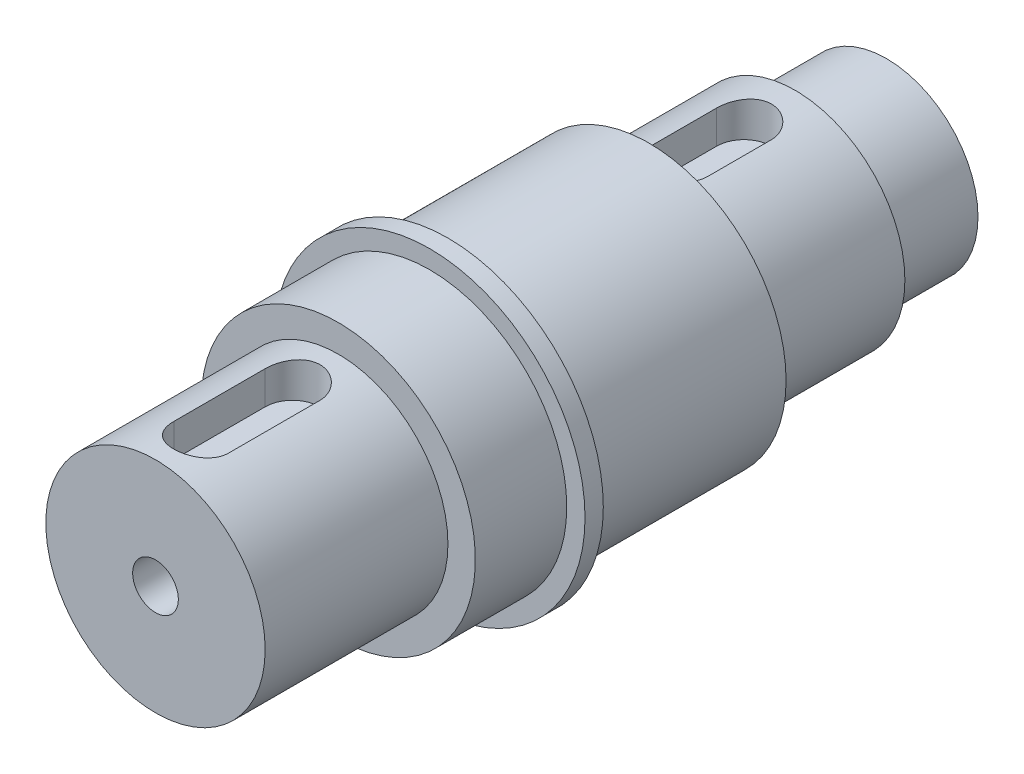
ISO-10303-21;
HEADER;
FILE_DESCRIPTION(('STEP AP214'),'2;1');
FILE_NAME('part.step','',(''),(''),'','','');
FILE_SCHEMA(('AUTOMOTIVE_DESIGN { 1 0 10303 214 1 1 1 1 }'));
ENDSEC;
DATA;
#1=APPLICATION_CONTEXT('core data for automotive mechanical design processes');
#2=APPLICATION_PROTOCOL_DEFINITION('international standard','automotive_design',2000,#1);
#3=PRODUCT_CONTEXT('',#1,'mechanical');
#4=PRODUCT('Part','Part','',(#3));
#5=PRODUCT_RELATED_PRODUCT_CATEGORY('part','',(#4));
#6=PRODUCT_DEFINITION_FORMATION('','',#4);
#7=PRODUCT_DEFINITION_CONTEXT('part definition',#1,'design');
#8=PRODUCT_DEFINITION('design','',#6,#7);
#9=PRODUCT_DEFINITION_SHAPE('','',#8);
#10=(LENGTH_UNIT() NAMED_UNIT(*) SI_UNIT(.MILLI.,.METRE.));
#11=(NAMED_UNIT(*) PLANE_ANGLE_UNIT() SI_UNIT($,.RADIAN.));
#12=(NAMED_UNIT(*) SI_UNIT($,.STERADIAN.) SOLID_ANGLE_UNIT());
#13=UNCERTAINTY_MEASURE_WITH_UNIT(LENGTH_MEASURE(1.E-05),#10,'distance_accuracy_value','');
#14=(GEOMETRIC_REPRESENTATION_CONTEXT(3) GLOBAL_UNCERTAINTY_ASSIGNED_CONTEXT((#13)) GLOBAL_UNIT_ASSIGNED_CONTEXT((#10,
#11,#12)) REPRESENTATION_CONTEXT('',''));
#15=CARTESIAN_POINT('',(0.,0.,0.));
#16=DIRECTION('',(0.,0.,1.));
#17=DIRECTION('',(1.,0.,0.));
#18=AXIS2_PLACEMENT_3D('',#15,#16,#17);
#19=CARTESIAN_POINT('',(0.,0.,29.));
#20=DIRECTION('',(0.,0.,-1.));
#21=DIRECTION('',(-1.,0.,0.));
#22=AXIS2_PLACEMENT_3D('',#19,#20,#21);
#23=CYLINDRICAL_SURFACE('',#22,7.5);
#24=CARTESIAN_POINT('',(0.,0.,13.));
#25=DIRECTION('',(0.,0.,1.));
#26=DIRECTION('',(1.,0.,0.));
#27=AXIS2_PLACEMENT_3D('',#24,#25,#26);
#28=CIRCLE('',#27,7.5);
#29=CARTESIAN_POINT('',(7.5,0.,13.));
#30=VERTEX_POINT('',#29);
#31=EDGE_CURVE('E161',#30,#30,#28,.T.);
#32=ORIENTED_EDGE('',*,*,#31,.T.);
#33=EDGE_LOOP('',(#32));
#34=FACE_BOUND('',#33,.T.);
#35=CARTESIAN_POINT('',(0.,0.,24.));
#36=DIRECTION('',(0.,0.,1.));
#37=DIRECTION('',(1.,0.,0.));
#38=AXIS2_PLACEMENT_3D('',#35,#36,#37);
#39=CIRCLE('',#38,7.5);
#40=CARTESIAN_POINT('',(7.5,0.,24.));
#41=VERTEX_POINT('',#40);
#42=EDGE_CURVE('E11',#41,#41,#39,.T.);
#43=ORIENTED_EDGE('',*,*,#42,.F.);
#44=EDGE_LOOP('',(#43));
#45=FACE_BOUND('',#44,.T.);
#46=ADVANCED_FACE('F43',(#34,#45),#23,.T.);
#47=CARTESIAN_POINT('',(0.,0.,5.));
#48=DIRECTION('',(0.,0.,-1.));
#49=DIRECTION('',(-1.,0.,0.));
#50=AXIS2_PLACEMENT_3D('',#47,#48,#49);
#51=CYLINDRICAL_SURFACE('',#50,5.);
#52=CARTESIAN_POINT('',(0.,0.,5.));
#53=DIRECTION('',(0.,0.,1.));
#54=DIRECTION('',(1.,0.,0.));
#55=AXIS2_PLACEMENT_3D('',#52,#53,#54);
#56=CIRCLE('',#55,5.);
#57=CARTESIAN_POINT('',(5.,0.,5.));
#58=VERTEX_POINT('',#57);
#59=EDGE_CURVE('E209',#58,#58,#56,.T.);
#60=ORIENTED_EDGE('',*,*,#59,.F.);
#61=EDGE_LOOP('',(#60));
#62=FACE_BOUND('',#61,.T.);
#63=CARTESIAN_POINT('',(0.,0.,0.));
#64=DIRECTION('',(0.,0.,1.));
#65=DIRECTION('',(1.,0.,0.));
#66=AXIS2_PLACEMENT_3D('',#63,#64,#65);
#67=CIRCLE('',#66,5.);
#68=CARTESIAN_POINT('',(5.,0.,0.));
#69=VERTEX_POINT('',#68);
#70=EDGE_CURVE('E208',#69,#69,#67,.T.);
#71=ORIENTED_EDGE('',*,*,#70,.T.);
#72=EDGE_LOOP('',(#71));
#73=FACE_BOUND('',#72,.T.);
#74=ADVANCED_FACE('F45',(#62,#73),#51,.T.);
#75=CARTESIAN_POINT('',(0.,0.,0.));
#76=DIRECTION('',(0.,0.,1.));
#77=DIRECTION('',(1.,0.,0.));
#78=AXIS2_PLACEMENT_3D('',#75,#76,#77);
#79=PLANE('',#78);
#80=ORIENTED_EDGE('',*,*,#70,.F.);
#81=EDGE_LOOP('',(#80));
#82=FACE_BOUND('',#81,.T.);
#83=ADVANCED_FACE('F255',(#82),#79,.F.);
#84=CARTESIAN_POINT('',(0.,0.,6.));
#85=DIRECTION('',(0.,0.,-1.));
#86=DIRECTION('',(-1.,0.,0.));
#87=AXIS2_PLACEMENT_3D('',#84,#85,#86);
#88=CYLINDRICAL_SURFACE('',#87,6.);
#89=DIRECTION('',(0.,0.,-1.));
#90=VECTOR('',#89,1.);
#91=CARTESIAN_POINT('',(1.5,5.80947501931113,6.));
#92=LINE('',#91,#90);
#93=CARTESIAN_POINT('',(1.5,5.80947501931113,7.8));
#94=VERTEX_POINT('',#93);
#95=CARTESIAN_POINT('',(1.5,5.80947501931113,11.3));
#96=VERTEX_POINT('',#95);
#97=EDGE_CURVE('E167',#94,#96,#92,.F.);
#98=ORIENTED_EDGE('',*,*,#97,.T.);
#99=CARTESIAN_POINT('',(1.5,5.80947501931113,11.3));
#100=CARTESIAN_POINT('',(1.50000050624417,5.80947222870266,11.3414944776598));
#101=CARTESIAN_POINT('',(1.49827711106305,5.80992014924206,11.3829683945273));
#102=CARTESIAN_POINT('',(1.49140694309363,5.81168857161838,11.4656060529553));
#103=CARTESIAN_POINT('',(1.48626074635902,5.81300892662531,11.5067698455306));
#104=CARTESIAN_POINT('',(1.46576285907379,5.81822566458081,11.6291797598133));
#105=CARTESIAN_POINT('',(1.44535154275874,5.82337804723213,11.7095847027233));
#106=CARTESIAN_POINT('',(1.391697114372,5.83643133882004,11.8656870106729));
#107=CARTESIAN_POINT('',(1.35845520813575,5.84433198946395,11.9413848173193));
#108=CARTESIAN_POINT('',(1.2801230670388,5.86198701707909,12.086167172971));
#109=CARTESIAN_POINT('',(1.2350296550354,5.87174189093471,12.1552499418365));
#110=CARTESIAN_POINT('',(1.1332267077421,5.89224393597038,12.2863158228592));
#111=CARTESIAN_POINT('',(1.07630590317596,5.90300686543374,12.3481323293683));
#112=CARTESIAN_POINT('',(0.952913670774347,5.9241765659429,12.4614531342241));
#113=CARTESIAN_POINT('',(0.886440719218249,5.93458327983806,12.5129557842019));
#114=CARTESIAN_POINT('',(0.744685349102538,5.95404273424872,12.604866502428));
#115=CARTESIAN_POINT('',(0.669293010501713,5.96307457022596,12.645109843976));
#116=CARTESIAN_POINT('',(0.51255388626438,5.97858519375883,12.7122871012951));
#117=CARTESIAN_POINT('',(0.431208276124516,5.98506448372051,12.7392236364497));
#118=CARTESIAN_POINT('',(0.266616162787742,5.99462850007692,12.7784884891662));
#119=CARTESIAN_POINT('',(0.183441483004288,5.99777929351951,12.7911015086342));
#120=CARTESIAN_POINT('',(0.0160991635225212,6.00056157226223,12.8022550573149));
#121=CARTESIAN_POINT('',(-0.0680683500430564,6.00019349990167,12.8007973552885));
#122=CARTESIAN_POINT('',(-0.233028739458142,5.99602856048604,12.7840550544718));
#123=CARTESIAN_POINT('',(-0.313855052609781,5.99230798016041,12.7690780751008));
#124=CARTESIAN_POINT('',(-0.471808066626508,5.98194495954744,12.7262169812259));
#125=CARTESIAN_POINT('',(-0.548934603635979,5.97530238998334,12.6983322956471));
#126=CARTESIAN_POINT('',(-0.698110929036807,5.95972496642698,12.630198078994));
#127=CARTESIAN_POINT('',(-0.770108444403371,5.95076990741333,12.5898389086507));
#128=CARTESIAN_POINT('',(-0.90641494684502,5.93153918312879,12.4979853052498));
#129=CARTESIAN_POINT('',(-0.970722773343431,5.92126331899798,12.4464891946202));
#130=CARTESIAN_POINT('',(-1.09165408456273,5.90018349034298,12.332181631878));
#131=CARTESIAN_POINT('',(-1.14802365458119,5.88937275716528,12.2691025451903));
#132=CARTESIAN_POINT('',(-1.24945436277935,5.8686925242601,12.1342551996084));
#133=CARTESIAN_POINT('',(-1.29451240536759,5.8588232826449,12.0624845700747));
#134=CARTESIAN_POINT('',(-1.37220706392894,5.84111720379488,11.9117816032644));
#135=CARTESIAN_POINT('',(-1.4047755268309,5.83329159013705,11.8328128026559));
#136=CARTESIAN_POINT('',(-1.45605352777474,5.82070588210583,11.6703246073726));
#137=CARTESIAN_POINT('',(-1.4747837838182,5.81594120642153,11.5868122172752));
#138=CARTESIAN_POINT('',(-1.49085695272641,5.81182936022286,11.4688139288616));
#139=CARTESIAN_POINT('',(-1.49428618645006,5.8109478466629,11.4351204451802));
#140=CARTESIAN_POINT('',(-1.49885513654609,5.80977093733462,11.367623315136));
#141=CARTESIAN_POINT('',(-1.49999855714407,5.80947459329191,11.3338199360671));
#142=CARTESIAN_POINT('',(-1.5,5.80947501931113,11.3));
#143=B_SPLINE_CURVE_WITH_KNOTS('',3,(#99,#100,#101,#102,#103,#104,#105,#106,#107,#108,#109,#110,
#111,#112,#113,#114,#115,#116,#117,#118,#119,#120,#121,#122,#123,#124,#125,#126,#127,#128,#129,
#130,#131,#132,#133,#134,#135,#136,#137,#138,#139,#140,#141,#142),.UNSPECIFIED.,.F.,.F.,(4,2,2,
2,2,2,2,2,2,2,2,2,2,2,2,2,2,2,2,2,2,4),(0.,0.124404795509656,0.248788659126976,
0.496844944620475,0.744877923137249,0.992977462090125,1.24596284614196,1.49898863030879,
1.75554280647352,2.01204646098637,2.26335722272987,2.51463639384958,2.76033818218913,
3.00605084213757,3.25398764175564,3.50196181446493,3.75662144301813,4.01135068771451,
4.26745080241601,4.52316671309979,4.62473773083972,4.72614401597507),.UNSPECIFIED.);
#144=CARTESIAN_POINT('',(-1.5,5.80947501931113,11.3));
#145=VERTEX_POINT('',#144);
#146=EDGE_CURVE('E213',#96,#145,#143,.T.);
#147=ORIENTED_EDGE('',*,*,#146,.T.);
#148=DIRECTION('',(0.,0.,-1.));
#149=VECTOR('',#148,1.);
#150=CARTESIAN_POINT('',(-1.5,5.80947501931113,6.));
#151=LINE('',#150,#149);
#152=CARTESIAN_POINT('',(-1.5,5.80947501931113,7.8));
#153=VERTEX_POINT('',#152);
#154=EDGE_CURVE('E375',#145,#153,#151,.T.);
#155=ORIENTED_EDGE('',*,*,#154,.T.);
#156=CARTESIAN_POINT('',(-1.5,5.80947501931113,7.8));
#157=CARTESIAN_POINT('',(-1.50000050624417,5.80947222870266,7.75850552234019));
#158=CARTESIAN_POINT('',(-1.49827711106305,5.80992014924206,7.71703160547266));
#159=CARTESIAN_POINT('',(-1.49140694309363,5.81168857161838,7.63439394704465));
#160=CARTESIAN_POINT('',(-1.48626074635902,5.81300892662531,7.59323015446936));
#161=CARTESIAN_POINT('',(-1.46576285907379,5.81822566458081,7.47082024018673));
#162=CARTESIAN_POINT('',(-1.44535154275874,5.82337804723213,7.39041529727669));
#163=CARTESIAN_POINT('',(-1.391697114372,5.83643133882004,7.23431298932705));
#164=CARTESIAN_POINT('',(-1.35845520813575,5.84433198946395,7.15861518268072));
#165=CARTESIAN_POINT('',(-1.2801230670388,5.86198701707909,7.01383282702901));
#166=CARTESIAN_POINT('',(-1.2350296550354,5.8717418909347,6.94475005816355));
#167=CARTESIAN_POINT('',(-1.1332267077421,5.89224393597038,6.81368417714085));
#168=CARTESIAN_POINT('',(-1.07630590317596,5.90300686543374,6.75186767063172));
#169=CARTESIAN_POINT('',(-0.952913670774345,5.9241765659429,6.63854686577594));
#170=CARTESIAN_POINT('',(-0.886440719218246,5.93458327983806,6.58704421579809));
#171=CARTESIAN_POINT('',(-0.744685349102535,5.95404273424873,6.49513349757203));
#172=CARTESIAN_POINT('',(-0.669293010501709,5.96307457022595,6.45489015602404));
#173=CARTESIAN_POINT('',(-0.512553886264378,5.97858519375883,6.38771289870494));
#174=CARTESIAN_POINT('',(-0.431208276124514,5.98506448372051,6.36077636355025));
#175=CARTESIAN_POINT('',(-0.26661616278774,5.99462850007692,6.32151151083385));
#176=CARTESIAN_POINT('',(-0.183441483004286,5.99777929351951,6.30889849136577));
#177=CARTESIAN_POINT('',(-0.0160991635225185,6.00056157226223,6.29774494268506));
#178=CARTESIAN_POINT('',(0.0680683500430592,6.00019349990167,6.29920264471149));
#179=CARTESIAN_POINT('',(0.233028739458145,5.99602856048604,6.31594494552818));
#180=CARTESIAN_POINT('',(0.313855052609783,5.99230798016041,6.33092192489922));
#181=CARTESIAN_POINT('',(0.471808066626511,5.98194495954744,6.37378301877412));
#182=CARTESIAN_POINT('',(0.548934603635982,5.97530238998334,6.40166770435287));
#183=CARTESIAN_POINT('',(0.698110929036809,5.95972496642698,6.46980192100598));
#184=CARTESIAN_POINT('',(0.770108444403373,5.95076990741333,6.51016109134926));
#185=CARTESIAN_POINT('',(0.906414946845022,5.93153918312879,6.6020146947502));
#186=CARTESIAN_POINT('',(0.970722773343433,5.92126331899798,6.65351080537983));
#187=CARTESIAN_POINT('',(1.09165408456274,5.90018349034298,6.76781836812197));
#188=CARTESIAN_POINT('',(1.14802365458119,5.88937275716528,6.83089745480972));
#189=CARTESIAN_POINT('',(1.24945436277936,5.8686925242601,6.9657448003916));
#190=CARTESIAN_POINT('',(1.29451240536759,5.8588232826449,7.03751542992534));
#191=CARTESIAN_POINT('',(1.37220706392894,5.84111720379488,7.18821839673565));
#192=CARTESIAN_POINT('',(1.4047755268309,5.83329159013705,7.26718719734413));
#193=CARTESIAN_POINT('',(1.45605352777474,5.82070588210583,7.42967539262743));
#194=CARTESIAN_POINT('',(1.4747837838182,5.81594120642153,7.51318778272476));
#195=CARTESIAN_POINT('',(1.49085695272641,5.81182936022286,7.63118607113836));
#196=CARTESIAN_POINT('',(1.49428618645006,5.8109478466629,7.66487955481977));
#197=CARTESIAN_POINT('',(1.49885513654609,5.80977093733462,7.73237668486398));
#198=CARTESIAN_POINT('',(1.49999855714407,5.80947459329191,7.76618006393294));
#199=CARTESIAN_POINT('',(1.5,5.80947501931113,7.8));
#200=B_SPLINE_CURVE_WITH_KNOTS('',3,(#156,#157,#158,#159,#160,#161,#162,#163,#164,#165,#166,
#167,#168,#169,#170,#171,#172,#173,#174,#175,#176,#177,#178,#179,#180,#181,#182,#183,#184,#185,
#186,#187,#188,#189,#190,#191,#192,#193,#194,#195,#196,#197,#198,#199),.UNSPECIFIED.,.F.,.F.,(4,
2,2,2,2,2,2,2,2,2,2,2,2,2,2,2,2,2,2,2,2,4),(0.,0.124404795509654,0.248788659126977,
0.496844944620476,0.744877923137248,0.992977462090123,1.24596284614196,1.49898863030879,
1.75554280647352,2.01204646098637,2.26335722272987,2.51463639384958,2.76033818218913,
3.00605084213757,3.25398764175565,3.50196181446493,3.75662144301813,4.01135068771451,
4.26745080241601,4.52316671309979,4.62473773083972,4.72614401597507),.UNSPECIFIED.);
#201=EDGE_CURVE('E67',#153,#94,#200,.T.);
#202=ORIENTED_EDGE('',*,*,#201,.T.);
#203=EDGE_LOOP('',(#98,#147,#155,#202));
#204=FACE_BOUND('',#203,.T.);
#205=CARTESIAN_POINT('',(0.,0.,5.));
#206=DIRECTION('',(0.,0.,1.));
#207=DIRECTION('',(1.,0.,0.));
#208=AXIS2_PLACEMENT_3D('',#205,#206,#207);
#209=CIRCLE('',#208,6.);
#210=CARTESIAN_POINT('',(6.,0.,5.));
#211=VERTEX_POINT('',#210);
#212=EDGE_CURVE('E204',#211,#211,#209,.T.);
#213=ORIENTED_EDGE('',*,*,#212,.T.);
#214=EDGE_LOOP('',(#213));
#215=FACE_BOUND('',#214,.T.);
#216=CARTESIAN_POINT('',(0.,0.,13.));
#217=DIRECTION('',(0.,0.,1.));
#218=DIRECTION('',(1.,0.,0.));
#219=AXIS2_PLACEMENT_3D('',#216,#217,#218);
#220=CIRCLE('',#219,6.);
#221=CARTESIAN_POINT('',(6.,0.,13.));
#222=VERTEX_POINT('',#221);
#223=EDGE_CURVE('E191',#222,#222,#220,.T.);
#224=ORIENTED_EDGE('',*,*,#223,.F.);
#225=EDGE_LOOP('',(#224));
#226=FACE_BOUND('',#225,.T.);
#227=ADVANCED_FACE('F232',(#204,#215,#226),#88,.T.);
#228=CARTESIAN_POINT('',(0.,0.,5.));
#229=DIRECTION('',(0.,0.,1.));
#230=DIRECTION('',(1.,0.,0.));
#231=AXIS2_PLACEMENT_3D('',#228,#229,#230);
#232=PLANE('',#231);
#233=ORIENTED_EDGE('',*,*,#59,.T.);
#234=EDGE_LOOP('',(#233));
#235=FACE_BOUND('',#234,.T.);
#236=ORIENTED_EDGE('',*,*,#212,.F.);
#237=EDGE_LOOP('',(#236));
#238=FACE_BOUND('',#237,.T.);
#239=ADVANCED_FACE('F250',(#235,#238),#232,.F.);
#240=CARTESIAN_POINT('',(0.,4.,7.8));
#241=DIRECTION('',(0.,1.,0.));
#242=DIRECTION('',(0.,0.,1.));
#243=AXIS2_PLACEMENT_3D('',#240,#241,#242);
#244=CYLINDRICAL_SURFACE('',#243,1.5);
#245=DIRECTION('',(0.,1.,0.));
#246=VECTOR('',#245,1.);
#247=CARTESIAN_POINT('',(-1.5,4.,7.8));
#248=LINE('',#247,#246);
#249=CARTESIAN_POINT('',(-1.5,4.,7.8));
#250=VERTEX_POINT('',#249);
#251=EDGE_CURVE('E187',#250,#153,#248,.T.);
#252=ORIENTED_EDGE('',*,*,#251,.F.);
#253=CARTESIAN_POINT('',(0.,4.,7.8));
#254=DIRECTION('',(0.,1.,0.));
#255=DIRECTION('',(0.,0.,1.));
#256=AXIS2_PLACEMENT_3D('',#253,#254,#255);
#257=CIRCLE('',#256,1.5);
#258=CARTESIAN_POINT('',(1.5,4.,7.8));
#259=VERTEX_POINT('',#258);
#260=EDGE_CURVE('E171',#259,#250,#257,.T.);
#261=ORIENTED_EDGE('',*,*,#260,.F.);
#262=DIRECTION('',(0.,1.,0.));
#263=VECTOR('',#262,1.);
#264=CARTESIAN_POINT('',(1.5,4.,7.8));
#265=LINE('',#264,#263);
#266=EDGE_CURVE('E188',#259,#94,#265,.T.);
#267=ORIENTED_EDGE('',*,*,#266,.T.);
#268=ORIENTED_EDGE('',*,*,#201,.F.);
#269=EDGE_LOOP('',(#252,#261,#267,#268));
#270=FACE_BOUND('',#269,.T.);
#271=ADVANCED_FACE('F247',(#270),#244,.F.);
#272=CARTESIAN_POINT('',(1.5,4.,7.8));
#273=DIRECTION('',(1.,0.,0.));
#274=DIRECTION('',(0.,0.,-1.));
#275=AXIS2_PLACEMENT_3D('',#272,#273,#274);
#276=PLANE('',#275);
#277=ORIENTED_EDGE('',*,*,#266,.F.);
#278=DIRECTION('',(0.,0.,-1.));
#279=VECTOR('',#278,1.);
#280=CARTESIAN_POINT('',(1.5,4.,7.8));
#281=LINE('',#280,#279);
#282=CARTESIAN_POINT('',(1.5,4.,11.3));
#283=VERTEX_POINT('',#282);
#284=EDGE_CURVE('E183',#283,#259,#281,.T.);
#285=ORIENTED_EDGE('',*,*,#284,.F.);
#286=DIRECTION('',(0.,1.,0.));
#287=VECTOR('',#286,1.);
#288=CARTESIAN_POINT('',(1.5,4.,11.3));
#289=LINE('',#288,#287);
#290=EDGE_CURVE('E192',#283,#96,#289,.T.);
#291=ORIENTED_EDGE('',*,*,#290,.T.);
#292=ORIENTED_EDGE('',*,*,#97,.F.);
#293=EDGE_LOOP('',(#277,#285,#291,#292));
#294=FACE_BOUND('',#293,.T.);
#295=ADVANCED_FACE('F241',(#294),#276,.F.);
#296=CARTESIAN_POINT('',(0.,4.,11.3));
#297=DIRECTION('',(0.,1.,0.));
#298=DIRECTION('',(0.,0.,1.));
#299=AXIS2_PLACEMENT_3D('',#296,#297,#298);
#300=CYLINDRICAL_SURFACE('',#299,1.5);
#301=ORIENTED_EDGE('',*,*,#290,.F.);
#302=CARTESIAN_POINT('',(0.,4.,11.3));
#303=DIRECTION('',(0.,1.,0.));
#304=DIRECTION('',(0.,0.,1.));
#305=AXIS2_PLACEMENT_3D('',#302,#303,#304);
#306=CIRCLE('',#305,1.5);
#307=CARTESIAN_POINT('',(-1.5,4.,11.3));
#308=VERTEX_POINT('',#307);
#309=EDGE_CURVE('E179',#308,#283,#306,.T.);
#310=ORIENTED_EDGE('',*,*,#309,.F.);
#311=DIRECTION('',(0.,1.,0.));
#312=VECTOR('',#311,1.);
#313=CARTESIAN_POINT('',(-1.5,4.,11.3));
#314=LINE('',#313,#312);
#315=EDGE_CURVE('E195',#308,#145,#314,.T.);
#316=ORIENTED_EDGE('',*,*,#315,.T.);
#317=ORIENTED_EDGE('',*,*,#146,.F.);
#318=EDGE_LOOP('',(#301,#310,#316,#317));
#319=FACE_BOUND('',#318,.T.);
#320=ADVANCED_FACE('F235',(#319),#300,.F.);
#321=CARTESIAN_POINT('',(-1.5,4.,7.8));
#322=DIRECTION('',(-1.,0.,0.));
#323=DIRECTION('',(0.,0.,1.));
#324=AXIS2_PLACEMENT_3D('',#321,#322,#323);
#325=PLANE('',#324);
#326=ORIENTED_EDGE('',*,*,#315,.F.);
#327=DIRECTION('',(0.,0.,1.));
#328=VECTOR('',#327,1.);
#329=CARTESIAN_POINT('',(-1.5,4.,7.8));
#330=LINE('',#329,#328);
#331=EDGE_CURVE('E175',#250,#308,#330,.T.);
#332=ORIENTED_EDGE('',*,*,#331,.F.);
#333=ORIENTED_EDGE('',*,*,#251,.T.);
#334=ORIENTED_EDGE('',*,*,#154,.F.);
#335=EDGE_LOOP('',(#326,#332,#333,#334));
#336=FACE_BOUND('',#335,.T.);
#337=ADVANCED_FACE('F240',(#336),#325,.F.);
#338=CARTESIAN_POINT('',(0.,4.,7.8));
#339=DIRECTION('',(0.,1.,0.));
#340=DIRECTION('',(0.,0.,1.));
#341=AXIS2_PLACEMENT_3D('',#338,#339,#340);
#342=PLANE('',#341);
#343=ORIENTED_EDGE('',*,*,#260,.T.);
#344=ORIENTED_EDGE('',*,*,#331,.T.);
#345=ORIENTED_EDGE('',*,*,#309,.T.);
#346=ORIENTED_EDGE('',*,*,#284,.T.);
#347=EDGE_LOOP('',(#343,#344,#345,#346));
#348=FACE_BOUND('',#347,.T.);
#349=ADVANCED_FACE('F245',(#348),#342,.T.);
#350=CARTESIAN_POINT('',(0.,0.,13.));
#351=DIRECTION('',(0.,0.,1.));
#352=DIRECTION('',(1.,0.,0.));
#353=AXIS2_PLACEMENT_3D('',#350,#351,#352);
#354=PLANE('',#353);
#355=ORIENTED_EDGE('',*,*,#223,.T.);
#356=EDGE_LOOP('',(#355));
#357=FACE_BOUND('',#356,.T.);
#358=ORIENTED_EDGE('',*,*,#31,.F.);
#359=EDGE_LOOP('',(#358));
#360=FACE_BOUND('',#359,.T.);
#361=ADVANCED_FACE('F323',(#357,#360),#354,.F.);
#362=CARTESIAN_POINT('',(0.,0.,25.));
#363=DIRECTION('',(0.,0.,1.));
#364=DIRECTION('',(1.,0.,0.));
#365=AXIS2_PLACEMENT_3D('',#362,#363,#364);
#366=PLANE('',#365);
#367=CARTESIAN_POINT('',(0.,0.,25.));
#368=DIRECTION('',(0.,0.,1.));
#369=DIRECTION('',(1.,0.,0.));
#370=AXIS2_PLACEMENT_3D('',#367,#368,#369);
#371=CIRCLE('',#370,8.5);
#372=CARTESIAN_POINT('',(8.5,0.,25.));
#373=VERTEX_POINT('',#372);
#374=EDGE_CURVE('E140',#373,#373,#371,.T.);
#375=ORIENTED_EDGE('',*,*,#374,.T.);
#376=EDGE_LOOP('',(#375));
#377=FACE_BOUND('',#376,.T.);
#378=CARTESIAN_POINT('',(0.,0.,25.));
#379=DIRECTION('',(0.,0.,1.));
#380=DIRECTION('',(1.,0.,0.));
#381=AXIS2_PLACEMENT_3D('',#378,#379,#380);
#382=CIRCLE('',#381,7.5);
#383=CARTESIAN_POINT('',(7.5,0.,25.));
#384=VERTEX_POINT('',#383);
#385=EDGE_CURVE('E288',#384,#384,#382,.T.);
#386=ORIENTED_EDGE('',*,*,#385,.F.);
#387=EDGE_LOOP('',(#386));
#388=FACE_BOUND('',#387,.T.);
#389=ADVANCED_FACE('F309',(#377,#388),#366,.T.);
#390=CARTESIAN_POINT('',(0.,0.,24.));
#391=DIRECTION('',(0.,0.,1.));
#392=DIRECTION('',(1.,0.,0.));
#393=AXIS2_PLACEMENT_3D('',#390,#391,#392);
#394=PLANE('',#393);
#395=CARTESIAN_POINT('',(0.,0.,24.));
#396=DIRECTION('',(0.,0.,1.));
#397=DIRECTION('',(1.,0.,0.));
#398=AXIS2_PLACEMENT_3D('',#395,#396,#397);
#399=CIRCLE('',#398,8.5);
#400=CARTESIAN_POINT('',(8.5,0.,24.));
#401=VERTEX_POINT('',#400);
#402=EDGE_CURVE('E293',#401,#401,#399,.T.);
#403=ORIENTED_EDGE('',*,*,#402,.F.);
#404=EDGE_LOOP('',(#403));
#405=FACE_BOUND('',#404,.T.);
#406=ORIENTED_EDGE('',*,*,#42,.T.);
#407=EDGE_LOOP('',(#406));
#408=FACE_BOUND('',#407,.T.);
#409=ADVANCED_FACE('F313',(#405,#408),#394,.F.);
#410=CARTESIAN_POINT('',(0.,0.,25.));
#411=DIRECTION('',(0.,0.,-1.));
#412=DIRECTION('',(-1.,0.,0.));
#413=AXIS2_PLACEMENT_3D('',#410,#411,#412);
#414=CYLINDRICAL_SURFACE('',#413,8.5);
#415=ORIENTED_EDGE('',*,*,#374,.F.);
#416=EDGE_LOOP('',(#415));
#417=FACE_BOUND('',#416,.T.);
#418=ORIENTED_EDGE('',*,*,#402,.T.);
#419=EDGE_LOOP('',(#418));
#420=FACE_BOUND('',#419,.T.);
#421=ADVANCED_FACE('F311',(#417,#420),#414,.T.);
#422=CARTESIAN_POINT('',(0.,4.,37.5));
#423=DIRECTION('',(0.,1.,0.));
#424=DIRECTION('',(0.,0.,1.));
#425=AXIS2_PLACEMENT_3D('',#422,#423,#424);
#426=PLANE('',#425);
#427=CARTESIAN_POINT('',(0.,4.,37.5));
#428=DIRECTION('',(0.,1.,0.));
#429=DIRECTION('',(0.,0.,1.));
#430=AXIS2_PLACEMENT_3D('',#427,#428,#429);
#431=CIRCLE('',#430,1.5);
#432=CARTESIAN_POINT('',(-1.5,4.,37.5));
#433=VERTEX_POINT('',#432);
#434=CARTESIAN_POINT('',(1.5,4.,37.5));
#435=VERTEX_POINT('',#434);
#436=EDGE_CURVE('E113',#433,#435,#431,.T.);
#437=ORIENTED_EDGE('',*,*,#436,.T.);
#438=DIRECTION('',(0.,0.,-1.));
#439=VECTOR('',#438,1.);
#440=CARTESIAN_POINT('',(1.5,4.,37.5));
#441=LINE('',#440,#439);
#442=CARTESIAN_POINT('',(1.5,4.,32.5));
#443=VERTEX_POINT('',#442);
#444=EDGE_CURVE('E122',#435,#443,#441,.T.);
#445=ORIENTED_EDGE('',*,*,#444,.T.);
#446=CARTESIAN_POINT('',(0.,4.,32.5));
#447=DIRECTION('',(0.,1.,0.));
#448=DIRECTION('',(0.,0.,1.));
#449=AXIS2_PLACEMENT_3D('',#446,#447,#448);
#450=CIRCLE('',#449,1.5);
#451=CARTESIAN_POINT('',(-1.5,4.,32.5));
#452=VERTEX_POINT('',#451);
#453=EDGE_CURVE('E129',#443,#452,#450,.T.);
#454=ORIENTED_EDGE('',*,*,#453,.T.);
#455=DIRECTION('',(0.,0.,1.));
#456=VECTOR('',#455,1.);
#457=CARTESIAN_POINT('',(-1.5,4.,37.5));
#458=LINE('',#457,#456);
#459=EDGE_CURVE('E119',#452,#433,#458,.T.);
#460=ORIENTED_EDGE('',*,*,#459,.T.);
#461=EDGE_LOOP('',(#437,#445,#454,#460));
#462=FACE_BOUND('',#461,.T.);
#463=ADVANCED_FACE('F131',(#462),#426,.T.);
#464=CARTESIAN_POINT('',(0.,0.,40.));
#465=DIRECTION('',(0.,0.,1.));
#466=DIRECTION('',(1.,0.,0.));
#467=AXIS2_PLACEMENT_3D('',#464,#465,#466);
#468=PLANE('',#467);
#469=CARTESIAN_POINT('',(0.,0.,40.));
#470=DIRECTION('',(0.,0.,1.));
#471=DIRECTION('',(1.,0.,0.));
#472=AXIS2_PLACEMENT_3D('',#469,#470,#471);
#473=CIRCLE('',#472,1.25);
#474=CARTESIAN_POINT('',(1.25,0.,40.));
#475=VERTEX_POINT('',#474);
#476=EDGE_CURVE('E300',#475,#475,#473,.T.);
#477=ORIENTED_EDGE('',*,*,#476,.F.);
#478=EDGE_LOOP('',(#477));
#479=FACE_BOUND('',#478,.T.);
#480=CARTESIAN_POINT('',(0.,0.,40.));
#481=DIRECTION('',(0.,0.,1.));
#482=DIRECTION('',(1.,0.,0.));
#483=AXIS2_PLACEMENT_3D('',#480,#481,#482);
#484=CIRCLE('',#483,6.);
#485=CARTESIAN_POINT('',(6.,0.,40.));
#486=VERTEX_POINT('',#485);
#487=EDGE_CURVE('E151',#486,#486,#484,.T.);
#488=ORIENTED_EDGE('',*,*,#487,.T.);
#489=EDGE_LOOP('',(#488));
#490=FACE_BOUND('',#489,.T.);
#491=ADVANCED_FACE('F328',(#479,#490),#468,.T.);
#492=CARTESIAN_POINT('',(0.,4.,37.5));
#493=DIRECTION('',(0.,1.,0.));
#494=DIRECTION('',(0.,0.,1.));
#495=AXIS2_PLACEMENT_3D('',#492,#493,#494);
#496=CYLINDRICAL_SURFACE('',#495,1.5);
#497=DIRECTION('',(0.,1.,0.));
#498=VECTOR('',#497,1.);
#499=CARTESIAN_POINT('',(1.5,4.,37.5));
#500=LINE('',#499,#498);
#501=CARTESIAN_POINT('',(1.5,5.80947501931113,37.5));
#502=VERTEX_POINT('',#501);
#503=EDGE_CURVE('E109',#435,#502,#500,.T.);
#504=ORIENTED_EDGE('',*,*,#503,.F.);
#505=ORIENTED_EDGE('',*,*,#436,.F.);
#506=DIRECTION('',(0.,1.,0.));
#507=VECTOR('',#506,1.);
#508=CARTESIAN_POINT('',(-1.5,4.,37.5));
#509=LINE('',#508,#507);
#510=CARTESIAN_POINT('',(-1.5,5.80947501931113,37.5));
#511=VERTEX_POINT('',#510);
#512=EDGE_CURVE('E148',#433,#511,#509,.T.);
#513=ORIENTED_EDGE('',*,*,#512,.T.);
#514=CARTESIAN_POINT('',(1.5,5.80947501931113,37.5));
#515=CARTESIAN_POINT('',(1.50000050624417,5.80947222870266,37.5414944776598));
#516=CARTESIAN_POINT('',(1.49827711106305,5.80992014924206,37.5829683945273));
#517=CARTESIAN_POINT('',(1.49140694309363,5.81168857161838,37.6656060529554));
#518=CARTESIAN_POINT('',(1.48626074635902,5.81300892662531,37.7067698455306));
#519=CARTESIAN_POINT('',(1.46576285907379,5.81822566458081,37.8291797598133));
#520=CARTESIAN_POINT('',(1.44535154275874,5.82337804723213,37.9095847027233));
#521=CARTESIAN_POINT('',(1.391697114372,5.83643133882004,38.065687010673));
#522=CARTESIAN_POINT('',(1.35845520813575,5.84433198946395,38.1413848173193));
#523=CARTESIAN_POINT('',(1.2801230670388,5.86198701707909,38.286167172971));
#524=CARTESIAN_POINT('',(1.2350296550354,5.8717418909347,38.3552499418364));
#525=CARTESIAN_POINT('',(1.13322670774211,5.89224393597038,38.4863158228592));
#526=CARTESIAN_POINT('',(1.07630590317596,5.90300686543374,38.5481323293683));
#527=CARTESIAN_POINT('',(0.952913670774347,5.9241765659429,38.6614531342241));
#528=CARTESIAN_POINT('',(0.886440719218249,5.93458327983806,38.7129557842019));
#529=CARTESIAN_POINT('',(0.744685349102538,5.95404273424873,38.804866502428));
#530=CARTESIAN_POINT('',(0.669293010501712,5.96307457022595,38.845109843976));
#531=CARTESIAN_POINT('',(0.512553886264378,5.97858519375883,38.9122871012951));
#532=CARTESIAN_POINT('',(0.431208276124515,5.98506448372051,38.9392236364498));
#533=CARTESIAN_POINT('',(0.26661616278774,5.99462850007692,38.9784884891662));
#534=CARTESIAN_POINT('',(0.183441483004286,5.99777929351951,38.9911015086342));
#535=CARTESIAN_POINT('',(0.0160991635225186,6.00056157226223,39.002255057315));
#536=CARTESIAN_POINT('',(-0.068068350043059,6.00019349990167,39.0007973552885));
#537=CARTESIAN_POINT('',(-0.233028739458144,5.99602856048604,38.9840550544718));
#538=CARTESIAN_POINT('',(-0.313855052609782,5.99230798016041,38.9690780751008));
#539=CARTESIAN_POINT('',(-0.47180806662651,5.98194495954744,38.9262169812259));
#540=CARTESIAN_POINT('',(-0.548934603635981,5.97530238998334,38.8983322956471));
#541=CARTESIAN_POINT('',(-0.698110929036809,5.95972496642698,38.830198078994));
#542=CARTESIAN_POINT('',(-0.770108444403373,5.95076990741333,38.7898389086507));
#543=CARTESIAN_POINT('',(-0.90641494684502,5.93153918312879,38.6979853052498));
#544=CARTESIAN_POINT('',(-0.970722773343432,5.92126331899798,38.6464891946202));
#545=CARTESIAN_POINT('',(-1.09165408456273,5.90018349034298,38.532181631878));
#546=CARTESIAN_POINT('',(-1.14802365458119,5.88937275716528,38.4691025451903));
#547=CARTESIAN_POINT('',(-1.24945436277936,5.8686925242601,38.3342551996084));
#548=CARTESIAN_POINT('',(-1.29451240536759,5.8588232826449,38.2624845700747));
#549=CARTESIAN_POINT('',(-1.37220706392894,5.84111720379488,38.1117816032644));
#550=CARTESIAN_POINT('',(-1.4047755268309,5.83329159013705,38.0328128026559));
#551=CARTESIAN_POINT('',(-1.45605352777474,5.82070588210583,37.8703246073726));
#552=CARTESIAN_POINT('',(-1.4747837838182,5.81594120642153,37.7868122172753));
#553=CARTESIAN_POINT('',(-1.49085695272641,5.81182936022286,37.6688139288617));
#554=CARTESIAN_POINT('',(-1.49428618645006,5.8109478466629,37.6351204451802));
#555=CARTESIAN_POINT('',(-1.49885513654609,5.80977093733462,37.567623315136));
#556=CARTESIAN_POINT('',(-1.49999855714407,5.80947459329191,37.5338199360671));
#557=CARTESIAN_POINT('',(-1.5,5.80947501931113,37.5));
#558=B_SPLINE_CURVE_WITH_KNOTS('',3,(#514,#515,#516,#517,#518,#519,#520,#521,#522,#523,#524,
#525,#526,#527,#528,#529,#530,#531,#532,#533,#534,#535,#536,#537,#538,#539,#540,#541,#542,#543,
#544,#545,#546,#547,#548,#549,#550,#551,#552,#553,#554,#555,#556,#557),.UNSPECIFIED.,.F.,.F.,(4,
2,2,2,2,2,2,2,2,2,2,2,2,2,2,2,2,2,2,2,2,4),(0.,0.124404795509657,0.248788659126982,
0.496844944620475,0.744877923137239,0.992977462090122,1.24596284614196,1.49898863030878,
1.75554280647352,2.01204646098637,2.26335722272987,2.51463639384958,2.76033818218913,
3.00605084213757,3.25398764175565,3.50196181446493,3.75662144301813,4.01135068771451,
4.26745080241599,4.52316671309978,4.62473773083971,4.72614401597506),.UNSPECIFIED.);
#559=EDGE_CURVE('E59',#502,#511,#558,.T.);
#560=ORIENTED_EDGE('',*,*,#559,.F.);
#561=EDGE_LOOP('',(#504,#505,#513,#560));
#562=FACE_BOUND('',#561,.T.);
#563=ADVANCED_FACE('F111',(#562),#496,.F.);
#564=CARTESIAN_POINT('',(1.5,4.,37.5));
#565=DIRECTION('',(1.,0.,0.));
#566=DIRECTION('',(0.,0.,-1.));
#567=AXIS2_PLACEMENT_3D('',#564,#565,#566);
#568=PLANE('',#567);
#569=DIRECTION('',(0.,1.,0.));
#570=VECTOR('',#569,1.);
#571=CARTESIAN_POINT('',(1.5,4.,32.5));
#572=LINE('',#571,#570);
#573=CARTESIAN_POINT('',(1.5,5.80947501931113,32.5));
#574=VERTEX_POINT('',#573);
#575=EDGE_CURVE('E118',#443,#574,#572,.T.);
#576=ORIENTED_EDGE('',*,*,#575,.F.);
#577=ORIENTED_EDGE('',*,*,#444,.F.);
#578=ORIENTED_EDGE('',*,*,#503,.T.);
#579=DIRECTION('',(0.,0.,-1.));
#580=VECTOR('',#579,1.);
#581=CARTESIAN_POINT('',(1.5,5.80947501931113,40.));
#582=LINE('',#581,#580);
#583=EDGE_CURVE('E631',#574,#502,#582,.F.);
#584=ORIENTED_EDGE('',*,*,#583,.F.);
#585=EDGE_LOOP('',(#576,#577,#578,#584));
#586=FACE_BOUND('',#585,.T.);
#587=ADVANCED_FACE('F123',(#586),#568,.F.);
#588=CARTESIAN_POINT('',(0.,4.,32.5));
#589=DIRECTION('',(0.,1.,0.));
#590=DIRECTION('',(0.,0.,1.));
#591=AXIS2_PLACEMENT_3D('',#588,#589,#590);
#592=CYLINDRICAL_SURFACE('',#591,1.5);
#593=DIRECTION('',(0.,1.,0.));
#594=VECTOR('',#593,1.);
#595=CARTESIAN_POINT('',(-1.5,4.,32.5));
#596=LINE('',#595,#594);
#597=CARTESIAN_POINT('',(-1.5,5.80947501931113,32.5));
#598=VERTEX_POINT('',#597);
#599=EDGE_CURVE('E152',#452,#598,#596,.T.);
#600=ORIENTED_EDGE('',*,*,#599,.F.);
#601=ORIENTED_EDGE('',*,*,#453,.F.);
#602=ORIENTED_EDGE('',*,*,#575,.T.);
#603=CARTESIAN_POINT('',(-1.5,5.80947501931113,32.5));
#604=CARTESIAN_POINT('',(-1.50000050624417,5.80947222870266,32.4585055223402));
#605=CARTESIAN_POINT('',(-1.49827711106305,5.80992014924206,32.4170316054727));
#606=CARTESIAN_POINT('',(-1.49140694309363,5.81168857161838,32.3343939470446));
#607=CARTESIAN_POINT('',(-1.48626074635902,5.81300892662531,32.2932301544694));
#608=CARTESIAN_POINT('',(-1.46576285907379,5.81822566458081,32.1708202401867));
#609=CARTESIAN_POINT('',(-1.44535154275874,5.82337804723213,32.0904152972767));
#610=CARTESIAN_POINT('',(-1.391697114372,5.83643133882004,31.9343129893271));
#611=CARTESIAN_POINT('',(-1.35845520813576,5.84433198946395,31.8586151826807));
#612=CARTESIAN_POINT('',(-1.2801230670388,5.86198701707909,31.713832827029));
#613=CARTESIAN_POINT('',(-1.2350296550354,5.8717418909347,31.6447500581636));
#614=CARTESIAN_POINT('',(-1.13322670774211,5.89224393597038,31.5136841771408));
#615=CARTESIAN_POINT('',(-1.07630590317597,5.90300686543374,31.4518676706317));
#616=CARTESIAN_POINT('',(-0.952913670774347,5.9241765659429,31.3385468657759));
#617=CARTESIAN_POINT('',(-0.886440719218249,5.93458327983806,31.2870442157981));
#618=CARTESIAN_POINT('',(-0.744685349102539,5.95404273424872,31.195133497572));
#619=CARTESIAN_POINT('',(-0.669293010501714,5.96307457022595,31.154890156024));
#620=CARTESIAN_POINT('',(-0.512553886264381,5.97858519375883,31.0877128987049));
#621=CARTESIAN_POINT('',(-0.431208276124516,5.98506448372051,31.0607763635503));
#622=CARTESIAN_POINT('',(-0.266616162787741,5.99462850007692,31.0215115108339));
#623=CARTESIAN_POINT('',(-0.183441483004288,5.99777929351951,31.0088984913658));
#624=CARTESIAN_POINT('',(-0.016099163522521,6.00056157226223,30.9977449426851));
#625=CARTESIAN_POINT('',(0.0680683500430567,6.00019349990167,30.9992026447115));
#626=CARTESIAN_POINT('',(0.233028739458142,5.99602856048604,31.0159449455282));
#627=CARTESIAN_POINT('',(0.313855052609781,5.99230798016041,31.0309219248992));
#628=CARTESIAN_POINT('',(0.471808066626508,5.98194495954744,31.0737830187741));
#629=CARTESIAN_POINT('',(0.54893460363598,5.97530238998334,31.1016677043529));
#630=CARTESIAN_POINT('',(0.698110929036807,5.95972496642698,31.169801921006));
#631=CARTESIAN_POINT('',(0.770108444403371,5.95076990741333,31.2101610913493));
#632=CARTESIAN_POINT('',(0.906414946845019,5.93153918312879,31.3020146947502));
#633=CARTESIAN_POINT('',(0.970722773343431,5.92126331899798,31.3535108053798));
#634=CARTESIAN_POINT('',(1.09165408456273,5.90018349034298,31.467818368122));
#635=CARTESIAN_POINT('',(1.14802365458119,5.88937275716528,31.5308974548097));
#636=CARTESIAN_POINT('',(1.24945436277935,5.8686925242601,31.6657448003916));
#637=CARTESIAN_POINT('',(1.29451240536759,5.8588232826449,31.7375154299253));
#638=CARTESIAN_POINT('',(1.37220706392894,5.84111720379488,31.8882183967356));
#639=CARTESIAN_POINT('',(1.4047755268309,5.83329159013705,31.9671871973441));
#640=CARTESIAN_POINT('',(1.45605352777474,5.82070588210583,32.1296753926274));
#641=CARTESIAN_POINT('',(1.47478378381819,5.81594120642153,32.2131877827248));
#642=CARTESIAN_POINT('',(1.4908569527264,5.81182936022286,32.3311860711383));
#643=CARTESIAN_POINT('',(1.49428618645006,5.8109478466629,32.3648795548198));
#644=CARTESIAN_POINT('',(1.49885513654609,5.80977093733462,32.432376684864));
#645=CARTESIAN_POINT('',(1.49999855714407,5.80947459329191,32.4661800639329));
#646=CARTESIAN_POINT('',(1.5,5.80947501931113,32.5));
#647=B_SPLINE_CURVE_WITH_KNOTS('',3,(#603,#604,#605,#606,#607,#608,#609,#610,#611,#612,#613,
#614,#615,#616,#617,#618,#619,#620,#621,#622,#623,#624,#625,#626,#627,#628,#629,#630,#631,#632,
#633,#634,#635,#636,#637,#638,#639,#640,#641,#642,#643,#644,#645,#646),.UNSPECIFIED.,.F.,.F.,(4,
2,2,2,2,2,2,2,2,2,2,2,2,2,2,2,2,2,2,2,2,4),(0.,0.124404795509657,0.248788659126981,
0.496844944620475,0.744877923137239,0.992977462090122,1.24596284614196,1.49898863030879,
1.75554280647352,2.01204646098637,2.26335722272987,2.51463639384958,2.76033818218913,
3.00605084213757,3.25398764175565,3.50196181446493,3.75662144301813,4.01135068771451,
4.267450802416,4.52316671309977,4.62473773083971,4.72614401597507),.UNSPECIFIED.);
#648=EDGE_CURVE('E166',#598,#574,#647,.T.);
#649=ORIENTED_EDGE('',*,*,#648,.F.);
#650=EDGE_LOOP('',(#600,#601,#602,#649));
#651=FACE_BOUND('',#650,.T.);
#652=ADVANCED_FACE('F332',(#651),#592,.F.);
#653=CARTESIAN_POINT('',(-1.5,4.,37.5));
#654=DIRECTION('',(-1.,0.,0.));
#655=DIRECTION('',(0.,0.,1.));
#656=AXIS2_PLACEMENT_3D('',#653,#654,#655);
#657=PLANE('',#656);
#658=ORIENTED_EDGE('',*,*,#512,.F.);
#659=ORIENTED_EDGE('',*,*,#459,.F.);
#660=ORIENTED_EDGE('',*,*,#599,.T.);
#661=DIRECTION('',(0.,0.,-1.));
#662=VECTOR('',#661,1.);
#663=CARTESIAN_POINT('',(-1.5,5.80947501931113,40.));
#664=LINE('',#663,#662);
#665=EDGE_CURVE('E52',#511,#598,#664,.T.);
#666=ORIENTED_EDGE('',*,*,#665,.F.);
#667=EDGE_LOOP('',(#658,#659,#660,#666));
#668=FACE_BOUND('',#667,.T.);
#669=ADVANCED_FACE('F329',(#668),#657,.F.);
#670=CARTESIAN_POINT('',(0.,0.,40.));
#671=DIRECTION('',(0.,0.,-1.));
#672=DIRECTION('',(-1.,0.,0.));
#673=AXIS2_PLACEMENT_3D('',#670,#671,#672);
#674=CYLINDRICAL_SURFACE('',#673,6.);
#675=ORIENTED_EDGE('',*,*,#665,.T.);
#676=ORIENTED_EDGE('',*,*,#648,.T.);
#677=ORIENTED_EDGE('',*,*,#583,.T.);
#678=ORIENTED_EDGE('',*,*,#559,.T.);
#679=EDGE_LOOP('',(#675,#676,#677,#678));
#680=FACE_BOUND('',#679,.T.);
#681=ORIENTED_EDGE('',*,*,#487,.F.);
#682=EDGE_LOOP('',(#681));
#683=FACE_BOUND('',#682,.T.);
#684=CARTESIAN_POINT('',(0.,0.,30.));
#685=DIRECTION('',(0.,0.,1.));
#686=DIRECTION('',(1.,0.,0.));
#687=AXIS2_PLACEMENT_3D('',#684,#685,#686);
#688=CIRCLE('',#687,6.);
#689=CARTESIAN_POINT('',(6.,0.,30.));
#690=VERTEX_POINT('',#689);
#691=EDGE_CURVE('E162',#690,#690,#688,.T.);
#692=ORIENTED_EDGE('',*,*,#691,.T.);
#693=EDGE_LOOP('',(#692));
#694=FACE_BOUND('',#693,.T.);
#695=ADVANCED_FACE('F282',(#680,#683,#694),#674,.T.);
#696=CARTESIAN_POINT('',(0.,0.,30.));
#697=DIRECTION('',(0.,0.,1.));
#698=DIRECTION('',(1.,0.,0.));
#699=AXIS2_PLACEMENT_3D('',#696,#697,#698);
#700=PLANE('',#699);
#701=ORIENTED_EDGE('',*,*,#691,.F.);
#702=EDGE_LOOP('',(#701));
#703=FACE_BOUND('',#702,.T.);
#704=CARTESIAN_POINT('',(0.,0.,30.));
#705=DIRECTION('',(0.,0.,-1.));
#706=DIRECTION('',(-1.,0.,0.));
#707=AXIS2_PLACEMENT_3D('',#704,#705,#706);
#708=CIRCLE('',#707,7.5);
#709=CARTESIAN_POINT('',(-7.5,0.,30.));
#710=VERTEX_POINT('',#709);
#711=EDGE_CURVE('E134',#710,#710,#708,.T.);
#712=ORIENTED_EDGE('',*,*,#711,.F.);
#713=EDGE_LOOP('',(#712));
#714=FACE_BOUND('',#713,.T.);
#715=ADVANCED_FACE('F272',(#703,#714),#700,.T.);
#716=ORIENTED_EDGE('',*,*,#385,.T.);
#717=EDGE_LOOP('',(#716));
#718=FACE_BOUND('',#717,.T.);
#719=ORIENTED_EDGE('',*,*,#711,.T.);
#720=EDGE_LOOP('',(#719));
#721=FACE_BOUND('',#720,.T.);
#722=ADVANCED_FACE('F261',(#718,#721),#23,.T.);
#723=CARTESIAN_POINT('',(0.,0.,32.));
#724=DIRECTION('',(0.,0.,1.));
#725=DIRECTION('',(1.,0.,0.));
#726=AXIS2_PLACEMENT_3D('',#723,#724,#725);
#727=CYLINDRICAL_SURFACE('',#726,1.25);
#728=CARTESIAN_POINT('',(0.,0.,32.));
#729=DIRECTION('',(0.,0.,1.));
#730=DIRECTION('',(1.,0.,0.));
#731=AXIS2_PLACEMENT_3D('',#728,#729,#730);
#732=CIRCLE('',#731,1.25);
#733=CARTESIAN_POINT('',(1.25,0.,32.));
#734=VERTEX_POINT('',#733);
#735=EDGE_CURVE('E294',#734,#734,#732,.T.);
#736=ORIENTED_EDGE('',*,*,#735,.F.);
#737=EDGE_LOOP('',(#736));
#738=FACE_BOUND('',#737,.T.);
#739=ORIENTED_EDGE('',*,*,#476,.T.);
#740=EDGE_LOOP('',(#739));
#741=FACE_BOUND('',#740,.T.);
#742=ADVANCED_FACE('F271',(#738,#741),#727,.F.);
#743=CARTESIAN_POINT('',(0.,0.,32.));
#744=DIRECTION('',(0.,0.,1.));
#745=DIRECTION('',(1.,0.,0.));
#746=AXIS2_PLACEMENT_3D('',#743,#744,#745);
#747=PLANE('',#746);
#748=ORIENTED_EDGE('',*,*,#735,.T.);
#749=EDGE_LOOP('',(#748));
#750=FACE_BOUND('',#749,.T.);
#751=ADVANCED_FACE('F278',(#750),#747,.T.);
#752=CLOSED_SHELL('',(#46,#74,#83,#227,#239,#271,#295,#320,#337,#349,#361,#389,#409,#421,#463,
#491,#563,#587,#652,#669,#695,#715,#722,#742,#751));
#753=MANIFOLD_SOLID_BREP('B2',#752);
#754=ADVANCED_BREP_SHAPE_REPRESENTATION('',(#18,#753),#14);
#755=SHAPE_DEFINITION_REPRESENTATION(#9,#754);
ENDSEC;
END-ISO-10303-21;
